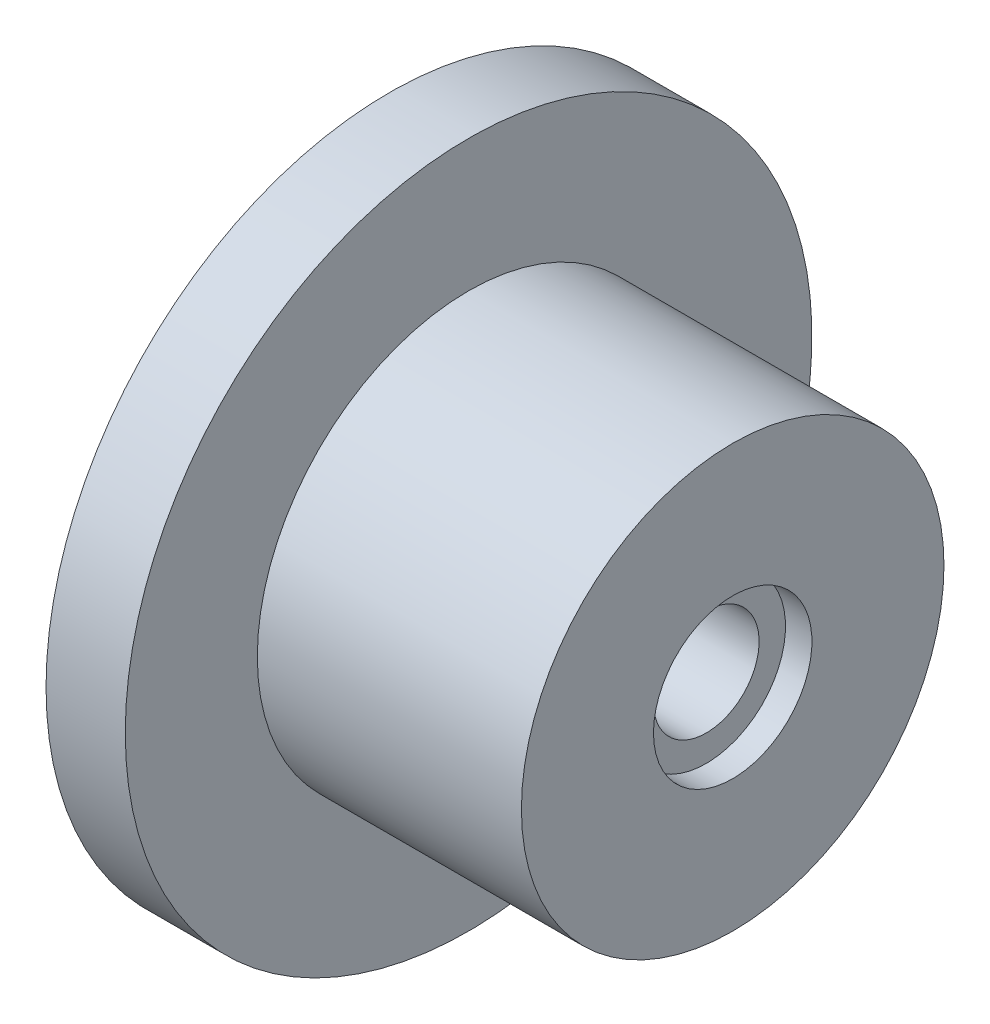
ISO-10303-21;
HEADER;
FILE_DESCRIPTION(('STEP AP214'),'2;1');
FILE_NAME('part.step','',(''),(''),'','','');
FILE_SCHEMA(('AUTOMOTIVE_DESIGN { 1 0 10303 214 1 1 1 1 }'));
ENDSEC;
DATA;
#1=APPLICATION_CONTEXT('core data for automotive mechanical design processes');
#2=APPLICATION_PROTOCOL_DEFINITION('international standard','automotive_design',2000,#1);
#3=PRODUCT_CONTEXT('',#1,'mechanical');
#4=PRODUCT('Part','Part','',(#3));
#5=PRODUCT_RELATED_PRODUCT_CATEGORY('part','',(#4));
#6=PRODUCT_DEFINITION_FORMATION('','',#4);
#7=PRODUCT_DEFINITION_CONTEXT('part definition',#1,'design');
#8=PRODUCT_DEFINITION('design','',#6,#7);
#9=PRODUCT_DEFINITION_SHAPE('','',#8);
#10=(LENGTH_UNIT() NAMED_UNIT(*) SI_UNIT(.MILLI.,.METRE.));
#11=(NAMED_UNIT(*) PLANE_ANGLE_UNIT() SI_UNIT($,.RADIAN.));
#12=(NAMED_UNIT(*) SI_UNIT($,.STERADIAN.) SOLID_ANGLE_UNIT());
#13=UNCERTAINTY_MEASURE_WITH_UNIT(LENGTH_MEASURE(1.E-05),#10,'distance_accuracy_value','');
#14=(GEOMETRIC_REPRESENTATION_CONTEXT(3) GLOBAL_UNCERTAINTY_ASSIGNED_CONTEXT((#13)) GLOBAL_UNIT_ASSIGNED_CONTEXT((#10,
#11,#12)) REPRESENTATION_CONTEXT('',''));
#15=CARTESIAN_POINT('',(0.,0.,0.));
#16=DIRECTION('',(0.,0.,1.));
#17=DIRECTION('',(1.,0.,0.));
#18=AXIS2_PLACEMENT_3D('',#15,#16,#17);
#19=CARTESIAN_POINT('',(8.,2.,0.));
#20=DIRECTION('',(-1.,0.,0.));
#21=DIRECTION('',(0.,0.,1.));
#22=AXIS2_PLACEMENT_3D('',#19,#20,#21);
#23=PLANE('',#22);
#24=CARTESIAN_POINT('',(8.,0.,0.));
#25=DIRECTION('',(-1.,0.,0.));
#26=DIRECTION('',(0.,0.,1.));
#27=AXIS2_PLACEMENT_3D('',#24,#25,#26);
#28=CIRCLE('',#27,3.);
#29=CARTESIAN_POINT('',(8.,0.,3.));
#30=VERTEX_POINT('',#29);
#31=EDGE_CURVE('E80',#30,#30,#28,.T.);
#32=ORIENTED_EDGE('',*,*,#31,.F.);
#33=EDGE_LOOP('',(#32));
#34=FACE_BOUND('',#33,.T.);
#35=CARTESIAN_POINT('',(8.,0.,0.));
#36=DIRECTION('',(-1.,0.,0.));
#37=DIRECTION('',(0.,0.,1.));
#38=AXIS2_PLACEMENT_3D('',#35,#36,#37);
#39=CIRCLE('',#38,2.);
#40=CARTESIAN_POINT('',(8.,0.,2.));
#41=VERTEX_POINT('',#40);
#42=EDGE_CURVE('E10',#41,#41,#39,.T.);
#43=ORIENTED_EDGE('',*,*,#42,.T.);
#44=EDGE_LOOP('',(#43));
#45=FACE_BOUND('',#44,.T.);
#46=ADVANCED_FACE('F37',(#34,#45),#23,.F.);
#47=CARTESIAN_POINT('',(0.,0.,0.));
#48=DIRECTION('',(-1.,0.,0.));
#49=DIRECTION('',(0.,0.,1.));
#50=AXIS2_PLACEMENT_3D('',#47,#48,#49);
#51=CYLINDRICAL_SURFACE('',#50,2.);
#52=ORIENTED_EDGE('',*,*,#42,.F.);
#53=EDGE_LOOP('',(#52));
#54=FACE_BOUND('',#53,.T.);
#55=CARTESIAN_POINT('',(0.,0.,0.));
#56=DIRECTION('',(-1.,0.,0.));
#57=DIRECTION('',(0.,0.,1.));
#58=AXIS2_PLACEMENT_3D('',#55,#56,#57);
#59=CIRCLE('',#58,2.);
#60=CARTESIAN_POINT('',(0.,0.,2.));
#61=VERTEX_POINT('',#60);
#62=EDGE_CURVE('E44',#61,#61,#59,.T.);
#63=ORIENTED_EDGE('',*,*,#62,.T.);
#64=EDGE_LOOP('',(#63));
#65=FACE_BOUND('',#64,.T.);
#66=ADVANCED_FACE('F88',(#54,#65),#51,.F.);
#67=CARTESIAN_POINT('',(0.,4.,0.));
#68=DIRECTION('',(1.,0.,0.));
#69=DIRECTION('',(0.,0.,-1.));
#70=AXIS2_PLACEMENT_3D('',#67,#68,#69);
#71=PLANE('',#70);
#72=ORIENTED_EDGE('',*,*,#62,.F.);
#73=EDGE_LOOP('',(#72));
#74=FACE_BOUND('',#73,.T.);
#75=CARTESIAN_POINT('',(0.,0.,0.));
#76=DIRECTION('',(-1.,0.,0.));
#77=DIRECTION('',(0.,0.,1.));
#78=AXIS2_PLACEMENT_3D('',#75,#76,#77);
#79=CIRCLE('',#78,4.);
#80=CARTESIAN_POINT('',(0.,0.,4.));
#81=VERTEX_POINT('',#80);
#82=EDGE_CURVE('E49',#81,#81,#79,.T.);
#83=ORIENTED_EDGE('',*,*,#82,.T.);
#84=EDGE_LOOP('',(#83));
#85=FACE_BOUND('',#84,.T.);
#86=ADVANCED_FACE('F92',(#74,#85),#71,.F.);
#87=CARTESIAN_POINT('',(0.,0.,0.));
#88=DIRECTION('',(-1.,0.,0.));
#89=DIRECTION('',(0.,0.,1.));
#90=AXIS2_PLACEMENT_3D('',#87,#88,#89);
#91=CYLINDRICAL_SURFACE('',#90,4.);
#92=ORIENTED_EDGE('',*,*,#82,.F.);
#93=EDGE_LOOP('',(#92));
#94=FACE_BOUND('',#93,.T.);
#95=CARTESIAN_POINT('',(-4.,0.,0.));
#96=DIRECTION('',(-1.,0.,0.));
#97=DIRECTION('',(0.,0.,1.));
#98=AXIS2_PLACEMENT_3D('',#95,#96,#97);
#99=CIRCLE('',#98,4.);
#100=CARTESIAN_POINT('',(-4.,0.,4.));
#101=VERTEX_POINT('',#100);
#102=EDGE_CURVE('E54',#101,#101,#99,.T.);
#103=ORIENTED_EDGE('',*,*,#102,.T.);
#104=EDGE_LOOP('',(#103));
#105=FACE_BOUND('',#104,.T.);
#106=ADVANCED_FACE('F97',(#94,#105),#91,.F.);
#107=CARTESIAN_POINT('',(-4.,13.,0.));
#108=DIRECTION('',(1.,0.,0.));
#109=DIRECTION('',(0.,0.,-1.));
#110=AXIS2_PLACEMENT_3D('',#107,#108,#109);
#111=PLANE('',#110);
#112=ORIENTED_EDGE('',*,*,#102,.F.);
#113=EDGE_LOOP('',(#112));
#114=FACE_BOUND('',#113,.T.);
#115=CARTESIAN_POINT('',(-4.,0.,0.));
#116=DIRECTION('',(-1.,0.,0.));
#117=DIRECTION('',(0.,0.,1.));
#118=AXIS2_PLACEMENT_3D('',#115,#116,#117);
#119=CIRCLE('',#118,13.);
#120=CARTESIAN_POINT('',(-4.,0.,13.));
#121=VERTEX_POINT('',#120);
#122=EDGE_CURVE('E60',#121,#121,#119,.T.);
#123=ORIENTED_EDGE('',*,*,#122,.T.);
#124=EDGE_LOOP('',(#123));
#125=FACE_BOUND('',#124,.T.);
#126=ADVANCED_FACE('F103',(#114,#125),#111,.F.);
#127=CARTESIAN_POINT('',(0.,0.,0.));
#128=DIRECTION('',(-1.,0.,0.));
#129=DIRECTION('',(0.,0.,1.));
#130=AXIS2_PLACEMENT_3D('',#127,#128,#129);
#131=CYLINDRICAL_SURFACE('',#130,13.);
#132=ORIENTED_EDGE('',*,*,#122,.F.);
#133=EDGE_LOOP('',(#132));
#134=FACE_BOUND('',#133,.T.);
#135=CARTESIAN_POINT('',(-1.,0.,0.));
#136=DIRECTION('',(-1.,0.,0.));
#137=DIRECTION('',(0.,0.,1.));
#138=AXIS2_PLACEMENT_3D('',#135,#136,#137);
#139=CIRCLE('',#138,13.);
#140=CARTESIAN_POINT('',(-1.,0.,13.));
#141=VERTEX_POINT('',#140);
#142=EDGE_CURVE('E64',#141,#141,#139,.T.);
#143=ORIENTED_EDGE('',*,*,#142,.T.);
#144=EDGE_LOOP('',(#143));
#145=FACE_BOUND('',#144,.T.);
#146=ADVANCED_FACE('F107',(#134,#145),#131,.T.);
#147=CARTESIAN_POINT('',(-1.,8.,0.));
#148=DIRECTION('',(-1.,0.,0.));
#149=DIRECTION('',(0.,0.,1.));
#150=AXIS2_PLACEMENT_3D('',#147,#148,#149);
#151=PLANE('',#150);
#152=ORIENTED_EDGE('',*,*,#142,.F.);
#153=EDGE_LOOP('',(#152));
#154=FACE_BOUND('',#153,.T.);
#155=CARTESIAN_POINT('',(-1.,0.,0.));
#156=DIRECTION('',(-1.,0.,0.));
#157=DIRECTION('',(0.,0.,1.));
#158=AXIS2_PLACEMENT_3D('',#155,#156,#157);
#159=CIRCLE('',#158,8.);
#160=CARTESIAN_POINT('',(-1.,0.,8.));
#161=VERTEX_POINT('',#160);
#162=EDGE_CURVE('E68',#161,#161,#159,.T.);
#163=ORIENTED_EDGE('',*,*,#162,.T.);
#164=EDGE_LOOP('',(#163));
#165=FACE_BOUND('',#164,.T.);
#166=ADVANCED_FACE('F111',(#154,#165),#151,.F.);
#167=CARTESIAN_POINT('',(0.,0.,0.));
#168=DIRECTION('',(-1.,0.,0.));
#169=DIRECTION('',(0.,0.,1.));
#170=AXIS2_PLACEMENT_3D('',#167,#168,#169);
#171=CYLINDRICAL_SURFACE('',#170,8.);
#172=ORIENTED_EDGE('',*,*,#162,.F.);
#173=EDGE_LOOP('',(#172));
#174=FACE_BOUND('',#173,.T.);
#175=CARTESIAN_POINT('',(9.,0.,0.));
#176=DIRECTION('',(-1.,0.,0.));
#177=DIRECTION('',(0.,0.,1.));
#178=AXIS2_PLACEMENT_3D('',#175,#176,#177);
#179=CIRCLE('',#178,8.);
#180=CARTESIAN_POINT('',(9.,0.,8.));
#181=VERTEX_POINT('',#180);
#182=EDGE_CURVE('E72',#181,#181,#179,.T.);
#183=ORIENTED_EDGE('',*,*,#182,.T.);
#184=EDGE_LOOP('',(#183));
#185=FACE_BOUND('',#184,.T.);
#186=ADVANCED_FACE('F115',(#174,#185),#171,.T.);
#187=CARTESIAN_POINT('',(9.,3.,0.));
#188=DIRECTION('',(-1.,0.,0.));
#189=DIRECTION('',(0.,0.,1.));
#190=AXIS2_PLACEMENT_3D('',#187,#188,#189);
#191=PLANE('',#190);
#192=ORIENTED_EDGE('',*,*,#182,.F.);
#193=EDGE_LOOP('',(#192));
#194=FACE_BOUND('',#193,.T.);
#195=CARTESIAN_POINT('',(9.,0.,0.));
#196=DIRECTION('',(-1.,0.,0.));
#197=DIRECTION('',(0.,0.,1.));
#198=AXIS2_PLACEMENT_3D('',#195,#196,#197);
#199=CIRCLE('',#198,3.);
#200=CARTESIAN_POINT('',(9.,0.,3.));
#201=VERTEX_POINT('',#200);
#202=EDGE_CURVE('E76',#201,#201,#199,.T.);
#203=ORIENTED_EDGE('',*,*,#202,.T.);
#204=EDGE_LOOP('',(#203));
#205=FACE_BOUND('',#204,.T.);
#206=ADVANCED_FACE('F119',(#194,#205),#191,.F.);
#207=CARTESIAN_POINT('',(0.,0.,0.));
#208=DIRECTION('',(-1.,0.,0.));
#209=DIRECTION('',(0.,0.,1.));
#210=AXIS2_PLACEMENT_3D('',#207,#208,#209);
#211=CYLINDRICAL_SURFACE('',#210,3.);
#212=ORIENTED_EDGE('',*,*,#202,.F.);
#213=EDGE_LOOP('',(#212));
#214=FACE_BOUND('',#213,.T.);
#215=ORIENTED_EDGE('',*,*,#31,.T.);
#216=EDGE_LOOP('',(#215));
#217=FACE_BOUND('',#216,.T.);
#218=ADVANCED_FACE('F85',(#214,#217),#211,.F.);
#219=CLOSED_SHELL('',(#46,#66,#86,#106,#126,#146,#166,#186,#206,#218));
#220=MANIFOLD_SOLID_BREP('B2',#219);
#221=ADVANCED_BREP_SHAPE_REPRESENTATION('',(#18,#220),#14);
#222=SHAPE_DEFINITION_REPRESENTATION(#9,#221);
ENDSEC;
END-ISO-10303-21;
